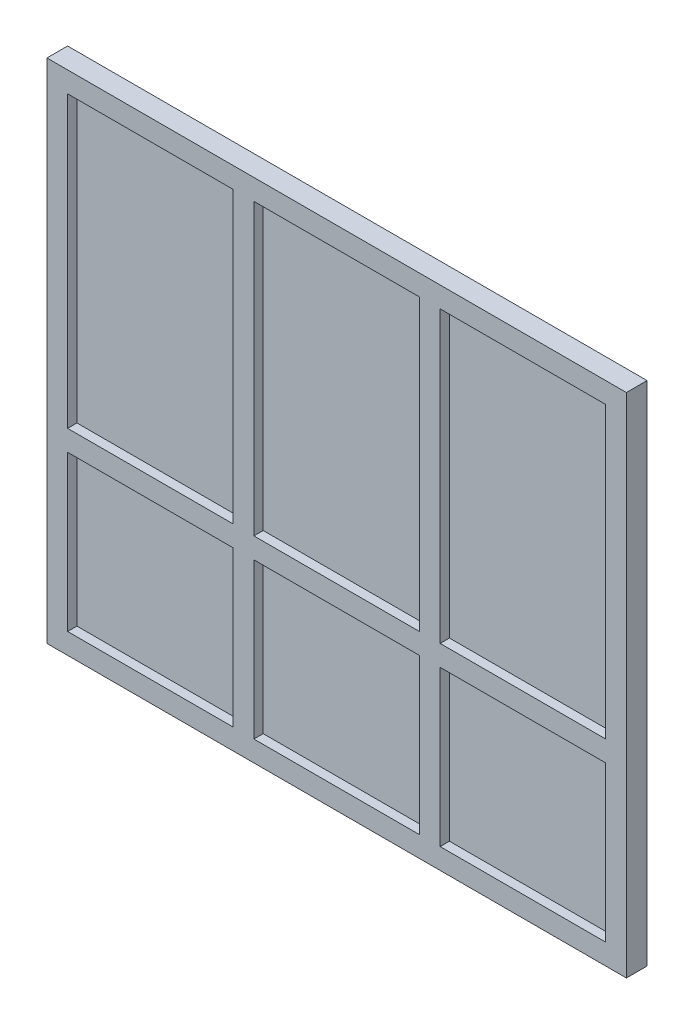
ISO-10303-21;
HEADER;
FILE_DESCRIPTION(('STEP AP214'),'2;1');
FILE_NAME('part.step','',(''),(''),'','','');
FILE_SCHEMA(('AUTOMOTIVE_DESIGN { 1 0 10303 214 1 1 1 1 }'));
ENDSEC;
DATA;
#1=APPLICATION_CONTEXT('core data for automotive mechanical design processes');
#2=APPLICATION_PROTOCOL_DEFINITION('international standard','automotive_design',2000,#1);
#3=PRODUCT_CONTEXT('',#1,'mechanical');
#4=PRODUCT('Part','Part','',(#3));
#5=PRODUCT_RELATED_PRODUCT_CATEGORY('part','',(#4));
#6=PRODUCT_DEFINITION_FORMATION('','',#4);
#7=PRODUCT_DEFINITION_CONTEXT('part definition',#1,'design');
#8=PRODUCT_DEFINITION('design','',#6,#7);
#9=PRODUCT_DEFINITION_SHAPE('','',#8);
#10=(LENGTH_UNIT() NAMED_UNIT(*) SI_UNIT(.MILLI.,.METRE.));
#11=(NAMED_UNIT(*) PLANE_ANGLE_UNIT() SI_UNIT($,.RADIAN.));
#12=(NAMED_UNIT(*) SI_UNIT($,.STERADIAN.) SOLID_ANGLE_UNIT());
#13=UNCERTAINTY_MEASURE_WITH_UNIT(LENGTH_MEASURE(1.E-05),#10,'distance_accuracy_value','');
#14=(GEOMETRIC_REPRESENTATION_CONTEXT(3) GLOBAL_UNCERTAINTY_ASSIGNED_CONTEXT((#13)) GLOBAL_UNIT_ASSIGNED_CONTEXT((#10,
#11,#12)) REPRESENTATION_CONTEXT('',''));
#15=CARTESIAN_POINT('',(0.,0.,0.));
#16=DIRECTION('',(0.,0.,1.));
#17=DIRECTION('',(1.,0.,0.));
#18=AXIS2_PLACEMENT_3D('',#15,#16,#17);
#19=CARTESIAN_POINT('',(1300.,2350.,45.));
#20=DIRECTION('',(-1.,0.,0.));
#21=DIRECTION('',(0.,-1.,0.));
#22=AXIS2_PLACEMENT_3D('',#19,#20,#21);
#23=PLANE('',#22);
#24=DIRECTION('',(0.,-1.,0.));
#25=VECTOR('',#24,1.);
#26=CARTESIAN_POINT('',(1300.,2350.,55.));
#27=LINE('',#26,#25);
#28=CARTESIAN_POINT('',(1300.,2350.,55.));
#29=VERTEX_POINT('',#28);
#30=CARTESIAN_POINT('',(1300.,100.000000000001,55.));
#31=VERTEX_POINT('',#30);
#32=EDGE_CURVE('E114',#29,#31,#27,.T.);
#33=ORIENTED_EDGE('',*,*,#32,.T.);
#34=DIRECTION('',(0.,0.,1.));
#35=VECTOR('',#34,1.);
#36=CARTESIAN_POINT('',(1300.,100.000000000001,45.));
#37=LINE('',#36,#35);
#38=CARTESIAN_POINT('',(1300.,100.000000000001,45.));
#39=VERTEX_POINT('',#38);
#40=EDGE_CURVE('E12',#39,#31,#37,.T.);
#41=ORIENTED_EDGE('',*,*,#40,.F.);
#42=DIRECTION('',(0.,-1.,0.));
#43=VECTOR('',#42,1.);
#44=CARTESIAN_POINT('',(1300.,2350.,45.));
#45=LINE('',#44,#43);
#46=CARTESIAN_POINT('',(1300.,2350.,45.));
#47=VERTEX_POINT('',#46);
#48=EDGE_CURVE('E102',#47,#39,#45,.T.);
#49=ORIENTED_EDGE('',*,*,#48,.F.);
#50=DIRECTION('',(0.,0.,1.));
#51=VECTOR('',#50,1.);
#52=CARTESIAN_POINT('',(1300.,2350.,45.));
#53=LINE('',#52,#51);
#54=EDGE_CURVE('E110',#47,#29,#53,.T.);
#55=ORIENTED_EDGE('',*,*,#54,.T.);
#56=EDGE_LOOP('',(#33,#41,#49,#55));
#57=FACE_BOUND('',#56,.T.);
#58=ADVANCED_FACE('F51',(#57),#23,.F.);
#59=CARTESIAN_POINT('',(1300.,100.000000000001,45.));
#60=DIRECTION('',(0.,1.,0.));
#61=DIRECTION('',(0.,0.,1.));
#62=AXIS2_PLACEMENT_3D('',#59,#60,#61);
#63=PLANE('',#62);
#64=DIRECTION('',(-1.,0.,0.));
#65=VECTOR('',#64,1.);
#66=CARTESIAN_POINT('',(1300.,100.000000000001,55.));
#67=LINE('',#66,#65);
#68=CARTESIAN_POINT('',(-1300.,100.000000000001,55.));
#69=VERTEX_POINT('',#68);
#70=EDGE_CURVE('E106',#31,#69,#67,.T.);
#71=ORIENTED_EDGE('',*,*,#70,.T.);
#72=DIRECTION('',(0.,0.,1.));
#73=VECTOR('',#72,1.);
#74=CARTESIAN_POINT('',(-1300.,100.000000000001,45.));
#75=LINE('',#74,#73);
#76=CARTESIAN_POINT('',(-1300.,100.000000000001,45.));
#77=VERTEX_POINT('',#76);
#78=EDGE_CURVE('E59',#77,#69,#75,.T.);
#79=ORIENTED_EDGE('',*,*,#78,.F.);
#80=DIRECTION('',(-1.,0.,0.));
#81=VECTOR('',#80,1.);
#82=CARTESIAN_POINT('',(1300.,100.000000000001,45.));
#83=LINE('',#82,#81);
#84=EDGE_CURVE('E97',#39,#77,#83,.T.);
#85=ORIENTED_EDGE('',*,*,#84,.F.);
#86=ORIENTED_EDGE('',*,*,#40,.T.);
#87=EDGE_LOOP('',(#71,#79,#85,#86));
#88=FACE_BOUND('',#87,.T.);
#89=ADVANCED_FACE('F105',(#88),#63,.F.);
#90=CARTESIAN_POINT('',(-1300.,2350.,45.));
#91=DIRECTION('',(1.,0.,0.));
#92=DIRECTION('',(0.,1.,0.));
#93=AXIS2_PLACEMENT_3D('',#90,#91,#92);
#94=PLANE('',#93);
#95=DIRECTION('',(0.,1.,0.));
#96=VECTOR('',#95,1.);
#97=CARTESIAN_POINT('',(-1300.,2350.,55.));
#98=LINE('',#97,#96);
#99=CARTESIAN_POINT('',(-1300.,2350.,55.));
#100=VERTEX_POINT('',#99);
#101=EDGE_CURVE('E84',#69,#100,#98,.T.);
#102=ORIENTED_EDGE('',*,*,#101,.T.);
#103=DIRECTION('',(0.,0.,1.));
#104=VECTOR('',#103,1.);
#105=CARTESIAN_POINT('',(-1300.,2350.,45.));
#106=LINE('',#105,#104);
#107=CARTESIAN_POINT('',(-1300.,2350.,45.));
#108=VERTEX_POINT('',#107);
#109=EDGE_CURVE('E107',#108,#100,#106,.T.);
#110=ORIENTED_EDGE('',*,*,#109,.F.);
#111=DIRECTION('',(0.,1.,0.));
#112=VECTOR('',#111,1.);
#113=CARTESIAN_POINT('',(-1300.,2350.,45.));
#114=LINE('',#113,#112);
#115=EDGE_CURVE('E100',#77,#108,#114,.T.);
#116=ORIENTED_EDGE('',*,*,#115,.F.);
#117=ORIENTED_EDGE('',*,*,#78,.T.);
#118=EDGE_LOOP('',(#102,#110,#116,#117));
#119=FACE_BOUND('',#118,.T.);
#120=ADVANCED_FACE('F108',(#119),#94,.F.);
#121=CARTESIAN_POINT('',(1300.,2350.,45.));
#122=DIRECTION('',(0.,-1.,0.));
#123=DIRECTION('',(0.,0.,-1.));
#124=AXIS2_PLACEMENT_3D('',#121,#122,#123);
#125=PLANE('',#124);
#126=DIRECTION('',(1.,0.,0.));
#127=VECTOR('',#126,1.);
#128=CARTESIAN_POINT('',(1300.,2350.,55.));
#129=LINE('',#128,#127);
#130=EDGE_CURVE('E90',#100,#29,#129,.T.);
#131=ORIENTED_EDGE('',*,*,#130,.T.);
#132=ORIENTED_EDGE('',*,*,#54,.F.);
#133=DIRECTION('',(1.,0.,0.));
#134=VECTOR('',#133,1.);
#135=CARTESIAN_POINT('',(1300.,2350.,45.));
#136=LINE('',#135,#134);
#137=EDGE_CURVE('E67',#108,#47,#136,.T.);
#138=ORIENTED_EDGE('',*,*,#137,.F.);
#139=ORIENTED_EDGE('',*,*,#109,.T.);
#140=EDGE_LOOP('',(#131,#132,#138,#139));
#141=FACE_BOUND('',#140,.T.);
#142=ADVANCED_FACE('F121',(#141),#125,.F.);
#143=CARTESIAN_POINT('',(0.,0.,45.));
#144=DIRECTION('',(0.,0.,-1.));
#145=DIRECTION('',(-1.,0.,0.));
#146=AXIS2_PLACEMENT_3D('',#143,#144,#145);
#147=PLANE('',#146);
#148=ORIENTED_EDGE('',*,*,#48,.T.);
#149=ORIENTED_EDGE('',*,*,#84,.T.);
#150=ORIENTED_EDGE('',*,*,#115,.T.);
#151=ORIENTED_EDGE('',*,*,#137,.T.);
#152=EDGE_LOOP('',(#148,#149,#150,#151));
#153=FACE_BOUND('',#152,.T.);
#154=ADVANCED_FACE('F98',(#153),#147,.T.);
#155=CARTESIAN_POINT('',(0.,0.,55.));
#156=DIRECTION('',(0.,0.,-1.));
#157=DIRECTION('',(-1.,0.,0.));
#158=AXIS2_PLACEMENT_3D('',#155,#156,#157);
#159=PLANE('',#158);
#160=ORIENTED_EDGE('',*,*,#32,.F.);
#161=ORIENTED_EDGE('',*,*,#130,.F.);
#162=ORIENTED_EDGE('',*,*,#101,.F.);
#163=ORIENTED_EDGE('',*,*,#70,.F.);
#164=EDGE_LOOP('',(#160,#161,#162,#163));
#165=FACE_BOUND('',#164,.T.);
#166=ADVANCED_FACE('F124',(#165),#159,.F.);
#167=CLOSED_SHELL('',(#58,#89,#120,#142,#154,#166));
#168=MANIFOLD_SOLID_BREP('B2',#167);
#169=CARTESIAN_POINT('',(0.,0.,100.));
#170=DIRECTION('',(0.,0.,1.));
#171=DIRECTION('',(1.,0.,0.));
#172=AXIS2_PLACEMENT_3D('',#169,#170,#171);
#173=PLANE('',#172);
#174=DIRECTION('',(0.,-1.,0.));
#175=VECTOR('',#174,1.);
#176=CARTESIAN_POINT('',(-1400.,0.,100.));
#177=LINE('',#176,#175);
#178=CARTESIAN_POINT('',(-1400.,2450.,100.));
#179=VERTEX_POINT('',#178);
#180=CARTESIAN_POINT('',(-1400.,0.,100.));
#181=VERTEX_POINT('',#180);
#182=EDGE_CURVE('E624',#179,#181,#177,.T.);
#183=ORIENTED_EDGE('',*,*,#182,.T.);
#184=DIRECTION('',(1.,0.,0.));
#185=VECTOR('',#184,1.);
#186=CARTESIAN_POINT('',(1400.,0.,100.));
#187=LINE('',#186,#185);
#188=CARTESIAN_POINT('',(1400.,0.,100.));
#189=VERTEX_POINT('',#188);
#190=EDGE_CURVE('E628',#181,#189,#187,.T.);
#191=ORIENTED_EDGE('',*,*,#190,.T.);
#192=DIRECTION('',(0.,1.,0.));
#193=VECTOR('',#192,1.);
#194=CARTESIAN_POINT('',(1400.,0.,100.));
#195=LINE('',#194,#193);
#196=CARTESIAN_POINT('',(1400.,2450.,100.));
#197=VERTEX_POINT('',#196);
#198=EDGE_CURVE('E632',#189,#197,#195,.T.);
#199=ORIENTED_EDGE('',*,*,#198,.T.);
#200=DIRECTION('',(-1.,0.,0.));
#201=VECTOR('',#200,1.);
#202=CARTESIAN_POINT('',(1400.,2450.,100.));
#203=LINE('',#202,#201);
#204=EDGE_CURVE('E635',#197,#179,#203,.T.);
#205=ORIENTED_EDGE('',*,*,#204,.T.);
#206=EDGE_LOOP('',(#183,#191,#199,#205));
#207=FACE_BOUND('',#206,.T.);
#208=DIRECTION('',(0.,-1.,0.));
#209=VECTOR('',#208,1.);
#210=CARTESIAN_POINT('',(-1300.,2350.,100.));
#211=LINE('',#210,#209);
#212=CARTESIAN_POINT('',(-1300.,2350.,100.));
#213=VERTEX_POINT('',#212);
#214=CARTESIAN_POINT('',(-1300.,950.,100.));
#215=VERTEX_POINT('',#214);
#216=EDGE_CURVE('E584',#213,#215,#211,.T.);
#217=ORIENTED_EDGE('',*,*,#216,.F.);
#218=DIRECTION('',(-1.,0.,0.));
#219=VECTOR('',#218,1.);
#220=CARTESIAN_POINT('',(-1300.,2350.,100.));
#221=LINE('',#220,#219);
#222=CARTESIAN_POINT('',(-500.,2350.,100.));
#223=VERTEX_POINT('',#222);
#224=EDGE_CURVE('E581',#223,#213,#221,.T.);
#225=ORIENTED_EDGE('',*,*,#224,.F.);
#226=DIRECTION('',(0.,1.,0.));
#227=VECTOR('',#226,1.);
#228=CARTESIAN_POINT('',(-500.,950.,100.));
#229=LINE('',#228,#227);
#230=CARTESIAN_POINT('',(-500.,950.,100.));
#231=VERTEX_POINT('',#230);
#232=EDGE_CURVE('E592',#231,#223,#229,.T.);
#233=ORIENTED_EDGE('',*,*,#232,.F.);
#234=DIRECTION('',(1.,0.,0.));
#235=VECTOR('',#234,1.);
#236=CARTESIAN_POINT('',(-1300.,950.,100.));
#237=LINE('',#236,#235);
#238=EDGE_CURVE('E588',#215,#231,#237,.T.);
#239=ORIENTED_EDGE('',*,*,#238,.F.);
#240=EDGE_LOOP('',(#217,#225,#233,#239));
#241=FACE_BOUND('',#240,.T.);
#242=DIRECTION('',(-1.,0.,0.));
#243=VECTOR('',#242,1.);
#244=CARTESIAN_POINT('',(-1300.,849.999999999999,100.));
#245=LINE('',#244,#243);
#246=CARTESIAN_POINT('',(-500.,849.999999999999,100.));
#247=VERTEX_POINT('',#246);
#248=CARTESIAN_POINT('',(-1300.,849.999999999999,100.));
#249=VERTEX_POINT('',#248);
#250=EDGE_CURVE('E541',#247,#249,#245,.T.);
#251=ORIENTED_EDGE('',*,*,#250,.F.);
#252=DIRECTION('',(0.,1.,0.));
#253=VECTOR('',#252,1.);
#254=CARTESIAN_POINT('',(-500.,849.999999999999,100.));
#255=LINE('',#254,#253);
#256=CARTESIAN_POINT('',(-500.,100.000000000001,100.));
#257=VERTEX_POINT('',#256);
#258=EDGE_CURVE('E538',#257,#247,#255,.T.);
#259=ORIENTED_EDGE('',*,*,#258,.F.);
#260=DIRECTION('',(1.,0.,0.));
#261=VECTOR('',#260,1.);
#262=CARTESIAN_POINT('',(-1300.,100.000000000001,100.));
#263=LINE('',#262,#261);
#264=CARTESIAN_POINT('',(-1300.,100.000000000001,100.));
#265=VERTEX_POINT('',#264);
#266=EDGE_CURVE('E549',#265,#257,#263,.T.);
#267=ORIENTED_EDGE('',*,*,#266,.F.);
#268=DIRECTION('',(0.,-1.,0.));
#269=VECTOR('',#268,1.);
#270=CARTESIAN_POINT('',(-1300.,100.000000000001,100.));
#271=LINE('',#270,#269);
#272=EDGE_CURVE('E545',#249,#265,#271,.T.);
#273=ORIENTED_EDGE('',*,*,#272,.F.);
#274=EDGE_LOOP('',(#251,#259,#267,#273));
#275=FACE_BOUND('',#274,.T.);
#276=DIRECTION('',(1.,0.,0.));
#277=VECTOR('',#276,1.);
#278=CARTESIAN_POINT('',(-399.999999999999,950.,100.));
#279=LINE('',#278,#277);
#280=CARTESIAN_POINT('',(-399.999999999999,950.,100.));
#281=VERTEX_POINT('',#280);
#282=CARTESIAN_POINT('',(399.999999999999,950.,100.));
#283=VERTEX_POINT('',#282);
#284=EDGE_CURVE('E498',#281,#283,#279,.T.);
#285=ORIENTED_EDGE('',*,*,#284,.F.);
#286=DIRECTION('',(0.,-1.,0.));
#287=VECTOR('',#286,1.);
#288=CARTESIAN_POINT('',(-399.999999999999,2350.,100.));
#289=LINE('',#288,#287);
#290=CARTESIAN_POINT('',(-399.999999999999,2350.,100.));
#291=VERTEX_POINT('',#290);
#292=EDGE_CURVE('E495',#291,#281,#289,.T.);
#293=ORIENTED_EDGE('',*,*,#292,.F.);
#294=DIRECTION('',(-1.,0.,0.));
#295=VECTOR('',#294,1.);
#296=CARTESIAN_POINT('',(-399.999999999999,2350.,100.));
#297=LINE('',#296,#295);
#298=CARTESIAN_POINT('',(400.,2350.,100.));
#299=VERTEX_POINT('',#298);
#300=EDGE_CURVE('E506',#299,#291,#297,.T.);
#301=ORIENTED_EDGE('',*,*,#300,.F.);
#302=DIRECTION('',(0.,1.,0.));
#303=VECTOR('',#302,1.);
#304=CARTESIAN_POINT('',(399.999999999999,950.,100.));
#305=LINE('',#304,#303);
#306=EDGE_CURVE('E502',#283,#299,#305,.T.);
#307=ORIENTED_EDGE('',*,*,#306,.F.);
#308=EDGE_LOOP('',(#285,#293,#301,#307));
#309=FACE_BOUND('',#308,.T.);
#310=DIRECTION('',(-1.,0.,0.));
#311=VECTOR('',#310,1.);
#312=CARTESIAN_POINT('',(-399.999999999999,849.999999999999,100.));
#313=LINE('',#312,#311);
#314=CARTESIAN_POINT('',(399.999999999999,849.999999999999,100.));
#315=VERTEX_POINT('',#314);
#316=CARTESIAN_POINT('',(-399.999999999999,849.999999999999,100.));
#317=VERTEX_POINT('',#316);
#318=EDGE_CURVE('E455',#315,#317,#313,.T.);
#319=ORIENTED_EDGE('',*,*,#318,.F.);
#320=DIRECTION('',(0.,1.,0.));
#321=VECTOR('',#320,1.);
#322=CARTESIAN_POINT('',(399.999999999999,849.999999999999,100.));
#323=LINE('',#322,#321);
#324=CARTESIAN_POINT('',(400.,100.000000000001,100.));
#325=VERTEX_POINT('',#324);
#326=EDGE_CURVE('E452',#325,#315,#323,.T.);
#327=ORIENTED_EDGE('',*,*,#326,.F.);
#328=DIRECTION('',(1.,0.,0.));
#329=VECTOR('',#328,1.);
#330=CARTESIAN_POINT('',(-399.999999999999,100.000000000001,100.));
#331=LINE('',#330,#329);
#332=CARTESIAN_POINT('',(-399.999999999999,100.000000000001,100.));
#333=VERTEX_POINT('',#332);
#334=EDGE_CURVE('E463',#333,#325,#331,.T.);
#335=ORIENTED_EDGE('',*,*,#334,.F.);
#336=DIRECTION('',(0.,-1.,0.));
#337=VECTOR('',#336,1.);
#338=CARTESIAN_POINT('',(-399.999999999999,100.000000000001,100.));
#339=LINE('',#338,#337);
#340=EDGE_CURVE('E459',#317,#333,#339,.T.);
#341=ORIENTED_EDGE('',*,*,#340,.F.);
#342=EDGE_LOOP('',(#319,#327,#335,#341));
#343=FACE_BOUND('',#342,.T.);
#344=DIRECTION('',(1.,0.,0.));
#345=VECTOR('',#344,1.);
#346=CARTESIAN_POINT('',(500.,950.,100.));
#347=LINE('',#346,#345);
#348=CARTESIAN_POINT('',(500.,950.,100.));
#349=VERTEX_POINT('',#348);
#350=CARTESIAN_POINT('',(1300.,950.,100.));
#351=VERTEX_POINT('',#350);
#352=EDGE_CURVE('E412',#349,#351,#347,.T.);
#353=ORIENTED_EDGE('',*,*,#352,.F.);
#354=DIRECTION('',(0.,-1.,0.));
#355=VECTOR('',#354,1.);
#356=CARTESIAN_POINT('',(499.999999999999,2350.,100.));
#357=LINE('',#356,#355);
#358=CARTESIAN_POINT('',(499.999999999999,2350.,100.));
#359=VERTEX_POINT('',#358);
#360=EDGE_CURVE('E409',#359,#349,#357,.T.);
#361=ORIENTED_EDGE('',*,*,#360,.F.);
#362=DIRECTION('',(-1.,0.,0.));
#363=VECTOR('',#362,1.);
#364=CARTESIAN_POINT('',(499.999999999999,2350.,100.));
#365=LINE('',#364,#363);
#366=CARTESIAN_POINT('',(1300.,2350.,100.));
#367=VERTEX_POINT('',#366);
#368=EDGE_CURVE('E420',#367,#359,#365,.T.);
#369=ORIENTED_EDGE('',*,*,#368,.F.);
#370=DIRECTION('',(0.,1.,0.));
#371=VECTOR('',#370,1.);
#372=CARTESIAN_POINT('',(1300.,950.,100.));
#373=LINE('',#372,#371);
#374=EDGE_CURVE('E416',#351,#367,#373,.T.);
#375=ORIENTED_EDGE('',*,*,#374,.F.);
#376=EDGE_LOOP('',(#353,#361,#369,#375));
#377=FACE_BOUND('',#376,.T.);
#378=DIRECTION('',(-1.,0.,0.));
#379=VECTOR('',#378,1.);
#380=CARTESIAN_POINT('',(500.,849.999999999999,100.));
#381=LINE('',#380,#379);
#382=CARTESIAN_POINT('',(1300.,849.999999999999,100.));
#383=VERTEX_POINT('',#382);
#384=CARTESIAN_POINT('',(500.,849.999999999999,100.));
#385=VERTEX_POINT('',#384);
#386=EDGE_CURVE('E370',#383,#385,#381,.T.);
#387=ORIENTED_EDGE('',*,*,#386,.F.);
#388=DIRECTION('',(0.,1.,0.));
#389=VECTOR('',#388,1.);
#390=CARTESIAN_POINT('',(1300.,849.999999999999,100.));
#391=LINE('',#390,#389);
#392=CARTESIAN_POINT('',(1300.,100.000000000001,100.));
#393=VERTEX_POINT('',#392);
#394=EDGE_CURVE('E361',#393,#383,#391,.T.);
#395=ORIENTED_EDGE('',*,*,#394,.F.);
#396=DIRECTION('',(1.,0.,0.));
#397=VECTOR('',#396,1.);
#398=CARTESIAN_POINT('',(500.000000000001,100.000000000001,100.));
#399=LINE('',#398,#397);
#400=CARTESIAN_POINT('',(500.000000000001,100.000000000001,100.));
#401=VERTEX_POINT('',#400);
#402=EDGE_CURVE('E387',#401,#393,#399,.T.);
#403=ORIENTED_EDGE('',*,*,#402,.F.);
#404=DIRECTION('',(0.,-1.,0.));
#405=VECTOR('',#404,1.);
#406=CARTESIAN_POINT('',(500.000000000001,100.000000000001,100.));
#407=LINE('',#406,#405);
#408=EDGE_CURVE('E383',#385,#401,#407,.T.);
#409=ORIENTED_EDGE('',*,*,#408,.F.);
#410=EDGE_LOOP('',(#387,#395,#403,#409));
#411=FACE_BOUND('',#410,.T.);
#412=ADVANCED_FACE('F175',(#207,#241,#275,#309,#343,#377,#411),#173,.T.);
#413=CARTESIAN_POINT('',(0.,0.,0.));
#414=DIRECTION('',(0.,0.,1.));
#415=DIRECTION('',(1.,0.,0.));
#416=AXIS2_PLACEMENT_3D('',#413,#414,#415);
#417=PLANE('',#416);
#418=DIRECTION('',(0.,-1.,0.));
#419=VECTOR('',#418,1.);
#420=CARTESIAN_POINT('',(499.999999999999,2350.,0.));
#421=LINE('',#420,#419);
#422=CARTESIAN_POINT('',(499.999999999999,2350.,0.));
#423=VERTEX_POINT('',#422);
#424=CARTESIAN_POINT('',(500.,950.,0.));
#425=VERTEX_POINT('',#424);
#426=EDGE_CURVE('E379',#423,#425,#421,.T.);
#427=ORIENTED_EDGE('',*,*,#426,.T.);
#428=DIRECTION('',(1.,0.,0.));
#429=VECTOR('',#428,1.);
#430=CARTESIAN_POINT('',(500.,950.,0.));
#431=LINE('',#430,#429);
#432=CARTESIAN_POINT('',(1300.,950.,0.));
#433=VERTEX_POINT('',#432);
#434=EDGE_CURVE('E427',#425,#433,#431,.T.);
#435=ORIENTED_EDGE('',*,*,#434,.T.);
#436=DIRECTION('',(0.,1.,0.));
#437=VECTOR('',#436,1.);
#438=CARTESIAN_POINT('',(1300.,950.,0.));
#439=LINE('',#438,#437);
#440=CARTESIAN_POINT('',(1300.,2350.,0.));
#441=VERTEX_POINT('',#440);
#442=EDGE_CURVE('E431',#433,#441,#439,.T.);
#443=ORIENTED_EDGE('',*,*,#442,.T.);
#444=DIRECTION('',(-1.,0.,0.));
#445=VECTOR('',#444,1.);
#446=CARTESIAN_POINT('',(499.999999999999,2350.,0.));
#447=LINE('',#446,#445);
#448=EDGE_CURVE('E413',#441,#423,#447,.T.);
#449=ORIENTED_EDGE('',*,*,#448,.T.);
#450=EDGE_LOOP('',(#427,#435,#443,#449));
#451=FACE_BOUND('',#450,.T.);
#452=DIRECTION('',(0.,-1.,0.));
#453=VECTOR('',#452,1.);
#454=CARTESIAN_POINT('',(-399.999999999999,2350.,0.));
#455=LINE('',#454,#453);
#456=CARTESIAN_POINT('',(-399.999999999999,2350.,0.));
#457=VERTEX_POINT('',#456);
#458=CARTESIAN_POINT('',(-399.999999999999,950.,0.));
#459=VERTEX_POINT('',#458);
#460=EDGE_CURVE('E494',#457,#459,#455,.T.);
#461=ORIENTED_EDGE('',*,*,#460,.T.);
#462=DIRECTION('',(1.,0.,0.));
#463=VECTOR('',#462,1.);
#464=CARTESIAN_POINT('',(-399.999999999999,950.,0.));
#465=LINE('',#464,#463);
#466=CARTESIAN_POINT('',(399.999999999999,950.,0.));
#467=VERTEX_POINT('',#466);
#468=EDGE_CURVE('E513',#459,#467,#465,.T.);
#469=ORIENTED_EDGE('',*,*,#468,.T.);
#470=DIRECTION('',(0.,1.,0.));
#471=VECTOR('',#470,1.);
#472=CARTESIAN_POINT('',(399.999999999999,950.,0.));
#473=LINE('',#472,#471);
#474=CARTESIAN_POINT('',(400.,2350.,0.));
#475=VERTEX_POINT('',#474);
#476=EDGE_CURVE('E517',#467,#475,#473,.T.);
#477=ORIENTED_EDGE('',*,*,#476,.T.);
#478=DIRECTION('',(-1.,0.,0.));
#479=VECTOR('',#478,1.);
#480=CARTESIAN_POINT('',(-399.999999999999,2350.,0.));
#481=LINE('',#480,#479);
#482=EDGE_CURVE('E499',#475,#457,#481,.T.);
#483=ORIENTED_EDGE('',*,*,#482,.T.);
#484=EDGE_LOOP('',(#461,#469,#477,#483));
#485=FACE_BOUND('',#484,.T.);
#486=DIRECTION('',(-1.,0.,0.));
#487=VECTOR('',#486,1.);
#488=CARTESIAN_POINT('',(-1300.,2350.,0.));
#489=LINE('',#488,#487);
#490=CARTESIAN_POINT('',(-500.,2350.,0.));
#491=VERTEX_POINT('',#490);
#492=CARTESIAN_POINT('',(-1300.,2350.,0.));
#493=VERTEX_POINT('',#492);
#494=EDGE_CURVE('E580',#491,#493,#489,.T.);
#495=ORIENTED_EDGE('',*,*,#494,.T.);
#496=DIRECTION('',(0.,-1.,0.));
#497=VECTOR('',#496,1.);
#498=CARTESIAN_POINT('',(-1300.,2350.,0.));
#499=LINE('',#498,#497);
#500=CARTESIAN_POINT('',(-1300.,950.,0.));
#501=VERTEX_POINT('',#500);
#502=EDGE_CURVE('E599',#493,#501,#499,.T.);
#503=ORIENTED_EDGE('',*,*,#502,.T.);
#504=DIRECTION('',(1.,0.,0.));
#505=VECTOR('',#504,1.);
#506=CARTESIAN_POINT('',(-1300.,950.,0.));
#507=LINE('',#506,#505);
#508=CARTESIAN_POINT('',(-500.,950.,0.));
#509=VERTEX_POINT('',#508);
#510=EDGE_CURVE('E603',#501,#509,#507,.T.);
#511=ORIENTED_EDGE('',*,*,#510,.T.);
#512=DIRECTION('',(0.,1.,0.));
#513=VECTOR('',#512,1.);
#514=CARTESIAN_POINT('',(-500.,950.,0.));
#515=LINE('',#514,#513);
#516=EDGE_CURVE('E585',#509,#491,#515,.T.);
#517=ORIENTED_EDGE('',*,*,#516,.T.);
#518=EDGE_LOOP('',(#495,#503,#511,#517));
#519=FACE_BOUND('',#518,.T.);
#520=DIRECTION('',(0.,-1.,0.));
#521=VECTOR('',#520,1.);
#522=CARTESIAN_POINT('',(-1400.,0.,0.));
#523=LINE('',#522,#521);
#524=CARTESIAN_POINT('',(-1400.,2450.,0.));
#525=VERTEX_POINT('',#524);
#526=CARTESIAN_POINT('',(-1400.,0.,0.));
#527=VERTEX_POINT('',#526);
#528=EDGE_CURVE('E623',#525,#527,#523,.T.);
#529=ORIENTED_EDGE('',*,*,#528,.F.);
#530=DIRECTION('',(-1.,0.,0.));
#531=VECTOR('',#530,1.);
#532=CARTESIAN_POINT('',(1400.,2450.,0.));
#533=LINE('',#532,#531);
#534=CARTESIAN_POINT('',(1400.,2450.,0.));
#535=VERTEX_POINT('',#534);
#536=EDGE_CURVE('E629',#535,#525,#533,.T.);
#537=ORIENTED_EDGE('',*,*,#536,.F.);
#538=DIRECTION('',(0.,1.,0.));
#539=VECTOR('',#538,1.);
#540=CARTESIAN_POINT('',(1400.,0.,0.));
#541=LINE('',#540,#539);
#542=CARTESIAN_POINT('',(1400.,0.,0.));
#543=VERTEX_POINT('',#542);
#544=EDGE_CURVE('E645',#543,#535,#541,.T.);
#545=ORIENTED_EDGE('',*,*,#544,.F.);
#546=DIRECTION('',(1.,0.,0.));
#547=VECTOR('',#546,1.);
#548=CARTESIAN_POINT('',(1400.,0.,0.));
#549=LINE('',#548,#547);
#550=EDGE_CURVE('E642',#527,#543,#549,.T.);
#551=ORIENTED_EDGE('',*,*,#550,.F.);
#552=EDGE_LOOP('',(#529,#537,#545,#551));
#553=FACE_BOUND('',#552,.T.);
#554=DIRECTION('',(0.,1.,0.));
#555=VECTOR('',#554,1.);
#556=CARTESIAN_POINT('',(-500.,849.999999999999,0.));
#557=LINE('',#556,#555);
#558=CARTESIAN_POINT('',(-500.,100.000000000001,0.));
#559=VERTEX_POINT('',#558);
#560=CARTESIAN_POINT('',(-500.,849.999999999999,0.));
#561=VERTEX_POINT('',#560);
#562=EDGE_CURVE('E537',#559,#561,#557,.T.);
#563=ORIENTED_EDGE('',*,*,#562,.T.);
#564=DIRECTION('',(-1.,0.,0.));
#565=VECTOR('',#564,1.);
#566=CARTESIAN_POINT('',(-1300.,849.999999999999,0.));
#567=LINE('',#566,#565);
#568=CARTESIAN_POINT('',(-1300.,849.999999999999,0.));
#569=VERTEX_POINT('',#568);
#570=EDGE_CURVE('E556',#561,#569,#567,.T.);
#571=ORIENTED_EDGE('',*,*,#570,.T.);
#572=DIRECTION('',(0.,-1.,0.));
#573=VECTOR('',#572,1.);
#574=CARTESIAN_POINT('',(-1300.,100.000000000001,0.));
#575=LINE('',#574,#573);
#576=CARTESIAN_POINT('',(-1300.,100.000000000001,0.));
#577=VERTEX_POINT('',#576);
#578=EDGE_CURVE('E560',#569,#577,#575,.T.);
#579=ORIENTED_EDGE('',*,*,#578,.T.);
#580=DIRECTION('',(1.,0.,0.));
#581=VECTOR('',#580,1.);
#582=CARTESIAN_POINT('',(-1300.,100.000000000001,0.));
#583=LINE('',#582,#581);
#584=EDGE_CURVE('E542',#577,#559,#583,.T.);
#585=ORIENTED_EDGE('',*,*,#584,.T.);
#586=EDGE_LOOP('',(#563,#571,#579,#585));
#587=FACE_BOUND('',#586,.T.);
#588=DIRECTION('',(0.,1.,0.));
#589=VECTOR('',#588,1.);
#590=CARTESIAN_POINT('',(399.999999999999,849.999999999999,0.));
#591=LINE('',#590,#589);
#592=CARTESIAN_POINT('',(400.,100.000000000001,0.));
#593=VERTEX_POINT('',#592);
#594=CARTESIAN_POINT('',(399.999999999999,849.999999999999,0.));
#595=VERTEX_POINT('',#594);
#596=EDGE_CURVE('E451',#593,#595,#591,.T.);
#597=ORIENTED_EDGE('',*,*,#596,.T.);
#598=DIRECTION('',(-1.,0.,0.));
#599=VECTOR('',#598,1.);
#600=CARTESIAN_POINT('',(-399.999999999999,849.999999999999,0.));
#601=LINE('',#600,#599);
#602=CARTESIAN_POINT('',(-399.999999999999,849.999999999999,0.));
#603=VERTEX_POINT('',#602);
#604=EDGE_CURVE('E470',#595,#603,#601,.T.);
#605=ORIENTED_EDGE('',*,*,#604,.T.);
#606=DIRECTION('',(0.,-1.,0.));
#607=VECTOR('',#606,1.);
#608=CARTESIAN_POINT('',(-399.999999999999,100.000000000001,0.));
#609=LINE('',#608,#607);
#610=CARTESIAN_POINT('',(-399.999999999999,100.000000000001,0.));
#611=VERTEX_POINT('',#610);
#612=EDGE_CURVE('E474',#603,#611,#609,.T.);
#613=ORIENTED_EDGE('',*,*,#612,.T.);
#614=DIRECTION('',(1.,0.,0.));
#615=VECTOR('',#614,1.);
#616=CARTESIAN_POINT('',(-399.999999999999,100.000000000001,0.));
#617=LINE('',#616,#615);
#618=EDGE_CURVE('E456',#611,#593,#617,.T.);
#619=ORIENTED_EDGE('',*,*,#618,.T.);
#620=EDGE_LOOP('',(#597,#605,#613,#619));
#621=FACE_BOUND('',#620,.T.);
#622=DIRECTION('',(0.,1.,0.));
#623=VECTOR('',#622,1.);
#624=CARTESIAN_POINT('',(1300.,849.999999999999,0.));
#625=LINE('',#624,#623);
#626=CARTESIAN_POINT('',(1300.,100.000000000001,0.));
#627=VERTEX_POINT('',#626);
#628=CARTESIAN_POINT('',(1300.,849.999999999999,0.));
#629=VERTEX_POINT('',#628);
#630=EDGE_CURVE('E199',#627,#629,#625,.T.);
#631=ORIENTED_EDGE('',*,*,#630,.T.);
#632=DIRECTION('',(-1.,0.,0.));
#633=VECTOR('',#632,1.);
#634=CARTESIAN_POINT('',(500.,849.999999999999,0.));
#635=LINE('',#634,#633);
#636=CARTESIAN_POINT('',(500.,849.999999999999,0.));
#637=VERTEX_POINT('',#636);
#638=EDGE_CURVE('E377',#629,#637,#635,.T.);
#639=ORIENTED_EDGE('',*,*,#638,.T.);
#640=DIRECTION('',(0.,-1.,0.));
#641=VECTOR('',#640,1.);
#642=CARTESIAN_POINT('',(500.000000000001,100.000000000001,0.));
#643=LINE('',#642,#641);
#644=CARTESIAN_POINT('',(500.000000000001,100.000000000001,0.));
#645=VERTEX_POINT('',#644);
#646=EDGE_CURVE('E396',#637,#645,#643,.T.);
#647=ORIENTED_EDGE('',*,*,#646,.T.);
#648=DIRECTION('',(1.,0.,0.));
#649=VECTOR('',#648,1.);
#650=CARTESIAN_POINT('',(500.000000000001,100.000000000001,0.));
#651=LINE('',#650,#649);
#652=EDGE_CURVE('E371',#645,#627,#651,.T.);
#653=ORIENTED_EDGE('',*,*,#652,.T.);
#654=EDGE_LOOP('',(#631,#639,#647,#653));
#655=FACE_BOUND('',#654,.T.);
#656=ADVANCED_FACE('F668',(#451,#485,#519,#553,#587,#621,#655),#417,.F.);
#657=CARTESIAN_POINT('',(-1400.,0.,100.));
#658=DIRECTION('',(1.,0.,0.));
#659=DIRECTION('',(0.,1.,0.));
#660=AXIS2_PLACEMENT_3D('',#657,#658,#659);
#661=PLANE('',#660);
#662=ORIENTED_EDGE('',*,*,#528,.T.);
#663=DIRECTION('',(0.,0.,-1.));
#664=VECTOR('',#663,1.);
#665=CARTESIAN_POINT('',(-1400.,0.,100.));
#666=LINE('',#665,#664);
#667=EDGE_CURVE('E49',#181,#527,#666,.T.);
#668=ORIENTED_EDGE('',*,*,#667,.F.);
#669=ORIENTED_EDGE('',*,*,#182,.F.);
#670=DIRECTION('',(0.,0.,-1.));
#671=VECTOR('',#670,1.);
#672=CARTESIAN_POINT('',(-1400.,2450.,100.));
#673=LINE('',#672,#671);
#674=EDGE_CURVE('E638',#179,#525,#673,.T.);
#675=ORIENTED_EDGE('',*,*,#674,.T.);
#676=EDGE_LOOP('',(#662,#668,#669,#675));
#677=FACE_BOUND('',#676,.T.);
#678=ADVANCED_FACE('F177',(#677),#661,.F.);
#679=CARTESIAN_POINT('',(1400.,0.,100.));
#680=DIRECTION('',(0.,1.,0.));
#681=DIRECTION('',(0.,0.,1.));
#682=AXIS2_PLACEMENT_3D('',#679,#680,#681);
#683=PLANE('',#682);
#684=ORIENTED_EDGE('',*,*,#550,.T.);
#685=DIRECTION('',(0.,0.,-1.));
#686=VECTOR('',#685,1.);
#687=CARTESIAN_POINT('',(1400.,0.,100.));
#688=LINE('',#687,#686);
#689=EDGE_CURVE('E184',#189,#543,#688,.T.);
#690=ORIENTED_EDGE('',*,*,#689,.F.);
#691=ORIENTED_EDGE('',*,*,#190,.F.);
#692=ORIENTED_EDGE('',*,*,#667,.T.);
#693=EDGE_LOOP('',(#684,#690,#691,#692));
#694=FACE_BOUND('',#693,.T.);
#695=ADVANCED_FACE('F679',(#694),#683,.F.);
#696=CARTESIAN_POINT('',(1400.,0.,100.));
#697=DIRECTION('',(-1.,0.,0.));
#698=DIRECTION('',(0.,-1.,0.));
#699=AXIS2_PLACEMENT_3D('',#696,#697,#698);
#700=PLANE('',#699);
#701=ORIENTED_EDGE('',*,*,#544,.T.);
#702=DIRECTION('',(0.,0.,-1.));
#703=VECTOR('',#702,1.);
#704=CARTESIAN_POINT('',(1400.,2450.,100.));
#705=LINE('',#704,#703);
#706=EDGE_CURVE('E653',#197,#535,#705,.T.);
#707=ORIENTED_EDGE('',*,*,#706,.F.);
#708=ORIENTED_EDGE('',*,*,#198,.F.);
#709=ORIENTED_EDGE('',*,*,#689,.T.);
#710=EDGE_LOOP('',(#701,#707,#708,#709));
#711=FACE_BOUND('',#710,.T.);
#712=ADVANCED_FACE('F662',(#711),#700,.F.);
#713=CARTESIAN_POINT('',(1400.,2450.,100.));
#714=DIRECTION('',(0.,-1.,0.));
#715=DIRECTION('',(1.,0.,0.));
#716=AXIS2_PLACEMENT_3D('',#713,#714,#715);
#717=PLANE('',#716);
#718=ORIENTED_EDGE('',*,*,#536,.T.);
#719=ORIENTED_EDGE('',*,*,#674,.F.);
#720=ORIENTED_EDGE('',*,*,#204,.F.);
#721=ORIENTED_EDGE('',*,*,#706,.T.);
#722=EDGE_LOOP('',(#718,#719,#720,#721));
#723=FACE_BOUND('',#722,.T.);
#724=ADVANCED_FACE('F672',(#723),#717,.F.);
#725=CARTESIAN_POINT('',(-1300.,2350.,100.));
#726=DIRECTION('',(0.,-1.,0.));
#727=DIRECTION('',(1.,0.,0.));
#728=AXIS2_PLACEMENT_3D('',#725,#726,#727);
#729=PLANE('',#728);
#730=ORIENTED_EDGE('',*,*,#494,.F.);
#731=DIRECTION('',(0.,0.,-1.));
#732=VECTOR('',#731,1.);
#733=CARTESIAN_POINT('',(-500.,2350.,100.));
#734=LINE('',#733,#732);
#735=EDGE_CURVE('E595',#223,#491,#734,.T.);
#736=ORIENTED_EDGE('',*,*,#735,.F.);
#737=ORIENTED_EDGE('',*,*,#224,.T.);
#738=DIRECTION('',(0.,0.,-1.));
#739=VECTOR('',#738,1.);
#740=CARTESIAN_POINT('',(-1300.,2350.,100.));
#741=LINE('',#740,#739);
#742=EDGE_CURVE('E619',#213,#493,#741,.T.);
#743=ORIENTED_EDGE('',*,*,#742,.T.);
#744=EDGE_LOOP('',(#730,#736,#737,#743));
#745=FACE_BOUND('',#744,.T.);
#746=ADVANCED_FACE('F694',(#745),#729,.T.);
#747=CARTESIAN_POINT('',(-1300.,2350.,100.));
#748=DIRECTION('',(1.,0.,0.));
#749=DIRECTION('',(0.,0.,-1.));
#750=AXIS2_PLACEMENT_3D('',#747,#748,#749);
#751=PLANE('',#750);
#752=ORIENTED_EDGE('',*,*,#502,.F.);
#753=ORIENTED_EDGE('',*,*,#742,.F.);
#754=ORIENTED_EDGE('',*,*,#216,.T.);
#755=DIRECTION('',(0.,0.,-1.));
#756=VECTOR('',#755,1.);
#757=CARTESIAN_POINT('',(-1300.,950.,100.));
#758=LINE('',#757,#756);
#759=EDGE_CURVE('E616',#215,#501,#758,.T.);
#760=ORIENTED_EDGE('',*,*,#759,.T.);
#761=EDGE_LOOP('',(#752,#753,#754,#760));
#762=FACE_BOUND('',#761,.T.);
#763=ADVANCED_FACE('F701',(#762),#751,.T.);
#764=CARTESIAN_POINT('',(-1300.,950.,100.));
#765=DIRECTION('',(0.,1.,0.));
#766=DIRECTION('',(-1.,0.,0.));
#767=AXIS2_PLACEMENT_3D('',#764,#765,#766);
#768=PLANE('',#767);
#769=ORIENTED_EDGE('',*,*,#510,.F.);
#770=ORIENTED_EDGE('',*,*,#759,.F.);
#771=ORIENTED_EDGE('',*,*,#238,.T.);
#772=DIRECTION('',(0.,0.,-1.));
#773=VECTOR('',#772,1.);
#774=CARTESIAN_POINT('',(-500.,950.,100.));
#775=LINE('',#774,#773);
#776=EDGE_CURVE('E613',#231,#509,#775,.T.);
#777=ORIENTED_EDGE('',*,*,#776,.T.);
#778=EDGE_LOOP('',(#769,#770,#771,#777));
#779=FACE_BOUND('',#778,.T.);
#780=ADVANCED_FACE('F706',(#779),#768,.T.);
#781=CARTESIAN_POINT('',(-500.,950.,100.));
#782=DIRECTION('',(-1.,0.,0.));
#783=DIRECTION('',(0.,0.,1.));
#784=AXIS2_PLACEMENT_3D('',#781,#782,#783);
#785=PLANE('',#784);
#786=ORIENTED_EDGE('',*,*,#516,.F.);
#787=ORIENTED_EDGE('',*,*,#776,.F.);
#788=ORIENTED_EDGE('',*,*,#232,.T.);
#789=ORIENTED_EDGE('',*,*,#735,.T.);
#790=EDGE_LOOP('',(#786,#787,#788,#789));
#791=FACE_BOUND('',#790,.T.);
#792=ADVANCED_FACE('F714',(#791),#785,.T.);
#793=CARTESIAN_POINT('',(-500.,849.999999999999,100.));
#794=DIRECTION('',(-1.,0.,0.));
#795=DIRECTION('',(0.,-1.,0.));
#796=AXIS2_PLACEMENT_3D('',#793,#794,#795);
#797=PLANE('',#796);
#798=ORIENTED_EDGE('',*,*,#562,.F.);
#799=DIRECTION('',(0.,0.,-1.));
#800=VECTOR('',#799,1.);
#801=CARTESIAN_POINT('',(-500.,100.000000000001,100.));
#802=LINE('',#801,#800);
#803=EDGE_CURVE('E552',#257,#559,#802,.T.);
#804=ORIENTED_EDGE('',*,*,#803,.F.);
#805=ORIENTED_EDGE('',*,*,#258,.T.);
#806=DIRECTION('',(0.,0.,-1.));
#807=VECTOR('',#806,1.);
#808=CARTESIAN_POINT('',(-500.,849.999999999999,100.));
#809=LINE('',#808,#807);
#810=EDGE_CURVE('E576',#247,#561,#809,.T.);
#811=ORIENTED_EDGE('',*,*,#810,.T.);
#812=EDGE_LOOP('',(#798,#804,#805,#811));
#813=FACE_BOUND('',#812,.T.);
#814=ADVANCED_FACE('F809',(#813),#797,.T.);
#815=CARTESIAN_POINT('',(-1300.,849.999999999999,100.));
#816=DIRECTION('',(0.,-1.,0.));
#817=DIRECTION('',(0.,0.,-1.));
#818=AXIS2_PLACEMENT_3D('',#815,#816,#817);
#819=PLANE('',#818);
#820=ORIENTED_EDGE('',*,*,#570,.F.);
#821=ORIENTED_EDGE('',*,*,#810,.F.);
#822=ORIENTED_EDGE('',*,*,#250,.T.);
#823=DIRECTION('',(0.,0.,-1.));
#824=VECTOR('',#823,1.);
#825=CARTESIAN_POINT('',(-1300.,849.999999999999,100.));
#826=LINE('',#825,#824);
#827=EDGE_CURVE('E573',#249,#569,#826,.T.);
#828=ORIENTED_EDGE('',*,*,#827,.T.);
#829=EDGE_LOOP('',(#820,#821,#822,#828));
#830=FACE_BOUND('',#829,.T.);
#831=ADVANCED_FACE('F805',(#830),#819,.T.);
#832=CARTESIAN_POINT('',(-1300.,100.000000000001,100.));
#833=DIRECTION('',(1.,0.,0.));
#834=DIRECTION('',(0.,1.,0.));
#835=AXIS2_PLACEMENT_3D('',#832,#833,#834);
#836=PLANE('',#835);
#837=ORIENTED_EDGE('',*,*,#578,.F.);
#838=ORIENTED_EDGE('',*,*,#827,.F.);
#839=ORIENTED_EDGE('',*,*,#272,.T.);
#840=DIRECTION('',(0.,0.,-1.));
#841=VECTOR('',#840,1.);
#842=CARTESIAN_POINT('',(-1300.,100.000000000001,100.));
#843=LINE('',#842,#841);
#844=EDGE_CURVE('E570',#265,#577,#843,.T.);
#845=ORIENTED_EDGE('',*,*,#844,.T.);
#846=EDGE_LOOP('',(#837,#838,#839,#845));
#847=FACE_BOUND('',#846,.T.);
#848=ADVANCED_FACE('F801',(#847),#836,.T.);
#849=CARTESIAN_POINT('',(-1300.,100.000000000001,100.));
#850=DIRECTION('',(0.,1.,0.));
#851=DIRECTION('',(0.,0.,1.));
#852=AXIS2_PLACEMENT_3D('',#849,#850,#851);
#853=PLANE('',#852);
#854=ORIENTED_EDGE('',*,*,#584,.F.);
#855=ORIENTED_EDGE('',*,*,#844,.F.);
#856=ORIENTED_EDGE('',*,*,#266,.T.);
#857=ORIENTED_EDGE('',*,*,#803,.T.);
#858=EDGE_LOOP('',(#854,#855,#856,#857));
#859=FACE_BOUND('',#858,.T.);
#860=ADVANCED_FACE('F797',(#859),#853,.T.);
#861=CARTESIAN_POINT('',(-399.999999999999,2350.,100.));
#862=DIRECTION('',(1.,0.,0.));
#863=DIRECTION('',(0.,1.,0.));
#864=AXIS2_PLACEMENT_3D('',#861,#862,#863);
#865=PLANE('',#864);
#866=ORIENTED_EDGE('',*,*,#460,.F.);
#867=DIRECTION('',(0.,0.,-1.));
#868=VECTOR('',#867,1.);
#869=CARTESIAN_POINT('',(-399.999999999999,2350.,100.));
#870=LINE('',#869,#868);
#871=EDGE_CURVE('E509',#291,#457,#870,.T.);
#872=ORIENTED_EDGE('',*,*,#871,.F.);
#873=ORIENTED_EDGE('',*,*,#292,.T.);
#874=DIRECTION('',(0.,0.,-1.));
#875=VECTOR('',#874,1.);
#876=CARTESIAN_POINT('',(-399.999999999999,950.,100.));
#877=LINE('',#876,#875);
#878=EDGE_CURVE('E533',#281,#459,#877,.T.);
#879=ORIENTED_EDGE('',*,*,#878,.T.);
#880=EDGE_LOOP('',(#866,#872,#873,#879));
#881=FACE_BOUND('',#880,.T.);
#882=ADVANCED_FACE('F793',(#881),#865,.T.);
#883=CARTESIAN_POINT('',(-399.999999999999,950.,100.));
#884=DIRECTION('',(0.,1.,0.));
#885=DIRECTION('',(-1.,0.,0.));
#886=AXIS2_PLACEMENT_3D('',#883,#884,#885);
#887=PLANE('',#886);
#888=ORIENTED_EDGE('',*,*,#468,.F.);
#889=ORIENTED_EDGE('',*,*,#878,.F.);
#890=ORIENTED_EDGE('',*,*,#284,.T.);
#891=DIRECTION('',(0.,0.,-1.));
#892=VECTOR('',#891,1.);
#893=CARTESIAN_POINT('',(399.999999999999,950.,100.));
#894=LINE('',#893,#892);
#895=EDGE_CURVE('E530',#283,#467,#894,.T.);
#896=ORIENTED_EDGE('',*,*,#895,.T.);
#897=EDGE_LOOP('',(#888,#889,#890,#896));
#898=FACE_BOUND('',#897,.T.);
#899=ADVANCED_FACE('F789',(#898),#887,.T.);
#900=CARTESIAN_POINT('',(399.999999999999,950.,100.));
#901=DIRECTION('',(-1.,0.,0.));
#902=DIRECTION('',(0.,-1.,0.));
#903=AXIS2_PLACEMENT_3D('',#900,#901,#902);
#904=PLANE('',#903);
#905=ORIENTED_EDGE('',*,*,#476,.F.);
#906=ORIENTED_EDGE('',*,*,#895,.F.);
#907=ORIENTED_EDGE('',*,*,#306,.T.);
#908=DIRECTION('',(0.,0.,-1.));
#909=VECTOR('',#908,1.);
#910=CARTESIAN_POINT('',(400.,2350.,100.));
#911=LINE('',#910,#909);
#912=EDGE_CURVE('E527',#299,#475,#911,.T.);
#913=ORIENTED_EDGE('',*,*,#912,.T.);
#914=EDGE_LOOP('',(#905,#906,#907,#913));
#915=FACE_BOUND('',#914,.T.);
#916=ADVANCED_FACE('F785',(#915),#904,.T.);
#917=CARTESIAN_POINT('',(-399.999999999999,2350.,100.));
#918=DIRECTION('',(0.,-1.,0.));
#919=DIRECTION('',(0.,0.,-1.));
#920=AXIS2_PLACEMENT_3D('',#917,#918,#919);
#921=PLANE('',#920);
#922=ORIENTED_EDGE('',*,*,#482,.F.);
#923=ORIENTED_EDGE('',*,*,#912,.F.);
#924=ORIENTED_EDGE('',*,*,#300,.T.);
#925=ORIENTED_EDGE('',*,*,#871,.T.);
#926=EDGE_LOOP('',(#922,#923,#924,#925));
#927=FACE_BOUND('',#926,.T.);
#928=ADVANCED_FACE('F781',(#927),#921,.T.);
#929=CARTESIAN_POINT('',(399.999999999999,849.999999999999,100.));
#930=DIRECTION('',(-1.,0.,0.));
#931=DIRECTION('',(0.,-1.,0.));
#932=AXIS2_PLACEMENT_3D('',#929,#930,#931);
#933=PLANE('',#932);
#934=ORIENTED_EDGE('',*,*,#596,.F.);
#935=DIRECTION('',(0.,0.,-1.));
#936=VECTOR('',#935,1.);
#937=CARTESIAN_POINT('',(400.,100.000000000001,100.));
#938=LINE('',#937,#936);
#939=EDGE_CURVE('E466',#325,#593,#938,.T.);
#940=ORIENTED_EDGE('',*,*,#939,.F.);
#941=ORIENTED_EDGE('',*,*,#326,.T.);
#942=DIRECTION('',(0.,0.,-1.));
#943=VECTOR('',#942,1.);
#944=CARTESIAN_POINT('',(399.999999999999,849.999999999999,100.));
#945=LINE('',#944,#943);
#946=EDGE_CURVE('E490',#315,#595,#945,.T.);
#947=ORIENTED_EDGE('',*,*,#946,.T.);
#948=EDGE_LOOP('',(#934,#940,#941,#947));
#949=FACE_BOUND('',#948,.T.);
#950=ADVANCED_FACE('F777',(#949),#933,.T.);
#951=CARTESIAN_POINT('',(-399.999999999999,849.999999999999,100.));
#952=DIRECTION('',(0.,-1.,0.));
#953=DIRECTION('',(1.,0.,0.));
#954=AXIS2_PLACEMENT_3D('',#951,#952,#953);
#955=PLANE('',#954);
#956=ORIENTED_EDGE('',*,*,#604,.F.);
#957=ORIENTED_EDGE('',*,*,#946,.F.);
#958=ORIENTED_EDGE('',*,*,#318,.T.);
#959=DIRECTION('',(0.,0.,-1.));
#960=VECTOR('',#959,1.);
#961=CARTESIAN_POINT('',(-399.999999999999,849.999999999999,100.));
#962=LINE('',#961,#960);
#963=EDGE_CURVE('E487',#317,#603,#962,.T.);
#964=ORIENTED_EDGE('',*,*,#963,.T.);
#965=EDGE_LOOP('',(#956,#957,#958,#964));
#966=FACE_BOUND('',#965,.T.);
#967=ADVANCED_FACE('F773',(#966),#955,.T.);
#968=CARTESIAN_POINT('',(-399.999999999999,100.000000000001,100.));
#969=DIRECTION('',(1.,0.,0.));
#970=DIRECTION('',(0.,1.,0.));
#971=AXIS2_PLACEMENT_3D('',#968,#969,#970);
#972=PLANE('',#971);
#973=ORIENTED_EDGE('',*,*,#612,.F.);
#974=ORIENTED_EDGE('',*,*,#963,.F.);
#975=ORIENTED_EDGE('',*,*,#340,.T.);
#976=DIRECTION('',(0.,0.,-1.));
#977=VECTOR('',#976,1.);
#978=CARTESIAN_POINT('',(-399.999999999999,100.000000000001,100.));
#979=LINE('',#978,#977);
#980=EDGE_CURVE('E484',#333,#611,#979,.T.);
#981=ORIENTED_EDGE('',*,*,#980,.T.);
#982=EDGE_LOOP('',(#973,#974,#975,#981));
#983=FACE_BOUND('',#982,.T.);
#984=ADVANCED_FACE('F769',(#983),#972,.T.);
#985=CARTESIAN_POINT('',(-399.999999999999,100.000000000001,100.));
#986=DIRECTION('',(0.,1.,0.));
#987=DIRECTION('',(0.,0.,1.));
#988=AXIS2_PLACEMENT_3D('',#985,#986,#987);
#989=PLANE('',#988);
#990=ORIENTED_EDGE('',*,*,#618,.F.);
#991=ORIENTED_EDGE('',*,*,#980,.F.);
#992=ORIENTED_EDGE('',*,*,#334,.T.);
#993=ORIENTED_EDGE('',*,*,#939,.T.);
#994=EDGE_LOOP('',(#990,#991,#992,#993));
#995=FACE_BOUND('',#994,.T.);
#996=ADVANCED_FACE('F766',(#995),#989,.T.);
#997=CARTESIAN_POINT('',(499.999999999999,2350.,100.));
#998=DIRECTION('',(1.,0.,0.));
#999=DIRECTION('',(0.,1.,0.));
#1000=AXIS2_PLACEMENT_3D('',#997,#998,#999);
#1001=PLANE('',#1000);
#1002=ORIENTED_EDGE('',*,*,#426,.F.);
#1003=DIRECTION('',(0.,0.,-1.));
#1004=VECTOR('',#1003,1.);
#1005=CARTESIAN_POINT('',(499.999999999999,2350.,100.));
#1006=LINE('',#1005,#1004);
#1007=EDGE_CURVE('E423',#359,#423,#1006,.T.);
#1008=ORIENTED_EDGE('',*,*,#1007,.F.);
#1009=ORIENTED_EDGE('',*,*,#360,.T.);
#1010=DIRECTION('',(0.,0.,-1.));
#1011=VECTOR('',#1010,1.);
#1012=CARTESIAN_POINT('',(500.,950.,100.));
#1013=LINE('',#1012,#1011);
#1014=EDGE_CURVE('E447',#349,#425,#1013,.T.);
#1015=ORIENTED_EDGE('',*,*,#1014,.T.);
#1016=EDGE_LOOP('',(#1002,#1008,#1009,#1015));
#1017=FACE_BOUND('',#1016,.T.);
#1018=ADVANCED_FACE('F748',(#1017),#1001,.T.);
#1019=CARTESIAN_POINT('',(500.,950.,100.));
#1020=DIRECTION('',(0.,1.,0.));
#1021=DIRECTION('',(-1.,0.,0.));
#1022=AXIS2_PLACEMENT_3D('',#1019,#1020,#1021);
#1023=PLANE('',#1022);
#1024=ORIENTED_EDGE('',*,*,#434,.F.);
#1025=ORIENTED_EDGE('',*,*,#1014,.F.);
#1026=ORIENTED_EDGE('',*,*,#352,.T.);
#1027=DIRECTION('',(0.,0.,-1.));
#1028=VECTOR('',#1027,1.);
#1029=CARTESIAN_POINT('',(1300.,950.,100.));
#1030=LINE('',#1029,#1028);
#1031=EDGE_CURVE('E444',#351,#433,#1030,.T.);
#1032=ORIENTED_EDGE('',*,*,#1031,.T.);
#1033=EDGE_LOOP('',(#1024,#1025,#1026,#1032));
#1034=FACE_BOUND('',#1033,.T.);
#1035=ADVANCED_FACE('F741',(#1034),#1023,.T.);
#1036=CARTESIAN_POINT('',(1300.,950.,100.));
#1037=DIRECTION('',(-1.,0.,0.));
#1038=DIRECTION('',(0.,0.,1.));
#1039=AXIS2_PLACEMENT_3D('',#1036,#1037,#1038);
#1040=PLANE('',#1039);
#1041=ORIENTED_EDGE('',*,*,#442,.F.);
#1042=ORIENTED_EDGE('',*,*,#1031,.F.);
#1043=ORIENTED_EDGE('',*,*,#374,.T.);
#1044=DIRECTION('',(0.,0.,-1.));
#1045=VECTOR('',#1044,1.);
#1046=CARTESIAN_POINT('',(1300.,2350.,100.));
#1047=LINE('',#1046,#1045);
#1048=EDGE_CURVE('E441',#367,#441,#1047,.T.);
#1049=ORIENTED_EDGE('',*,*,#1048,.T.);
#1050=EDGE_LOOP('',(#1041,#1042,#1043,#1049));
#1051=FACE_BOUND('',#1050,.T.);
#1052=ADVANCED_FACE('F744',(#1051),#1040,.T.);
#1053=CARTESIAN_POINT('',(499.999999999999,2350.,100.));
#1054=DIRECTION('',(0.,-1.,0.));
#1055=DIRECTION('',(1.,0.,0.));
#1056=AXIS2_PLACEMENT_3D('',#1053,#1054,#1055);
#1057=PLANE('',#1056);
#1058=ORIENTED_EDGE('',*,*,#448,.F.);
#1059=ORIENTED_EDGE('',*,*,#1048,.F.);
#1060=ORIENTED_EDGE('',*,*,#368,.T.);
#1061=ORIENTED_EDGE('',*,*,#1007,.T.);
#1062=EDGE_LOOP('',(#1058,#1059,#1060,#1061));
#1063=FACE_BOUND('',#1062,.T.);
#1064=ADVANCED_FACE('F751',(#1063),#1057,.T.);
#1065=CARTESIAN_POINT('',(1300.,849.999999999999,100.));
#1066=DIRECTION('',(-1.,0.,0.));
#1067=DIRECTION('',(0.,-1.,0.));
#1068=AXIS2_PLACEMENT_3D('',#1065,#1066,#1067);
#1069=PLANE('',#1068);
#1070=ORIENTED_EDGE('',*,*,#630,.F.);
#1071=DIRECTION('',(0.,0.,-1.));
#1072=VECTOR('',#1071,1.);
#1073=CARTESIAN_POINT('',(1300.,100.000000000001,100.));
#1074=LINE('',#1073,#1072);
#1075=EDGE_CURVE('E365',#393,#627,#1074,.T.);
#1076=ORIENTED_EDGE('',*,*,#1075,.F.);
#1077=ORIENTED_EDGE('',*,*,#394,.T.);
#1078=DIRECTION('',(0.,0.,-1.));
#1079=VECTOR('',#1078,1.);
#1080=CARTESIAN_POINT('',(1300.,849.999999999999,100.));
#1081=LINE('',#1080,#1079);
#1082=EDGE_CURVE('E364',#383,#629,#1081,.T.);
#1083=ORIENTED_EDGE('',*,*,#1082,.T.);
#1084=EDGE_LOOP('',(#1070,#1076,#1077,#1083));
#1085=FACE_BOUND('',#1084,.T.);
#1086=ADVANCED_FACE('F363',(#1085),#1069,.T.);
#1087=CARTESIAN_POINT('',(500.,849.999999999999,100.));
#1088=DIRECTION('',(0.,-1.,0.));
#1089=DIRECTION('',(1.,0.,0.));
#1090=AXIS2_PLACEMENT_3D('',#1087,#1088,#1089);
#1091=PLANE('',#1090);
#1092=ORIENTED_EDGE('',*,*,#638,.F.);
#1093=ORIENTED_EDGE('',*,*,#1082,.F.);
#1094=ORIENTED_EDGE('',*,*,#386,.T.);
#1095=DIRECTION('',(0.,0.,-1.));
#1096=VECTOR('',#1095,1.);
#1097=CARTESIAN_POINT('',(500.,849.999999999999,100.));
#1098=LINE('',#1097,#1096);
#1099=EDGE_CURVE('E380',#385,#637,#1098,.T.);
#1100=ORIENTED_EDGE('',*,*,#1099,.T.);
#1101=EDGE_LOOP('',(#1092,#1093,#1094,#1100));
#1102=FACE_BOUND('',#1101,.T.);
#1103=ADVANCED_FACE('F374',(#1102),#1091,.T.);
#1104=CARTESIAN_POINT('',(500.000000000001,100.000000000001,100.));
#1105=DIRECTION('',(1.,0.,0.));
#1106=DIRECTION('',(0.,1.,0.));
#1107=AXIS2_PLACEMENT_3D('',#1104,#1105,#1106);
#1108=PLANE('',#1107);
#1109=ORIENTED_EDGE('',*,*,#646,.F.);
#1110=ORIENTED_EDGE('',*,*,#1099,.F.);
#1111=ORIENTED_EDGE('',*,*,#408,.T.);
#1112=DIRECTION('',(0.,0.,-1.));
#1113=VECTOR('',#1112,1.);
#1114=CARTESIAN_POINT('',(500.000000000001,100.000000000001,100.));
#1115=LINE('',#1114,#1113);
#1116=EDGE_CURVE('E191',#401,#645,#1115,.T.);
#1117=ORIENTED_EDGE('',*,*,#1116,.T.);
#1118=EDGE_LOOP('',(#1109,#1110,#1111,#1117));
#1119=FACE_BOUND('',#1118,.T.);
#1120=ADVANCED_FACE('F904',(#1119),#1108,.T.);
#1121=CARTESIAN_POINT('',(500.000000000001,100.000000000001,100.));
#1122=DIRECTION('',(0.,1.,0.));
#1123=DIRECTION('',(0.,0.,1.));
#1124=AXIS2_PLACEMENT_3D('',#1121,#1122,#1123);
#1125=PLANE('',#1124);
#1126=ORIENTED_EDGE('',*,*,#652,.F.);
#1127=ORIENTED_EDGE('',*,*,#1116,.F.);
#1128=ORIENTED_EDGE('',*,*,#402,.T.);
#1129=ORIENTED_EDGE('',*,*,#1075,.T.);
#1130=EDGE_LOOP('',(#1126,#1127,#1128,#1129));
#1131=FACE_BOUND('',#1130,.T.);
#1132=ADVANCED_FACE('F912',(#1131),#1125,.T.);
#1133=CLOSED_SHELL('',(#412,#656,#678,#695,#712,#724,#746,#763,#780,#792,#814,#831,#848,#860,
#882,#899,#916,#928,#950,#967,#984,#996,#1018,#1035,#1052,#1064,#1086,#1103,#1120,#1132));
#1134=MANIFOLD_SOLID_BREP('B6',#1133);
#1135=ADVANCED_BREP_SHAPE_REPRESENTATION('',(#18,#168,#1134),#14);
#1136=SHAPE_DEFINITION_REPRESENTATION(#9,#1135);
ENDSEC;
END-ISO-10303-21;
